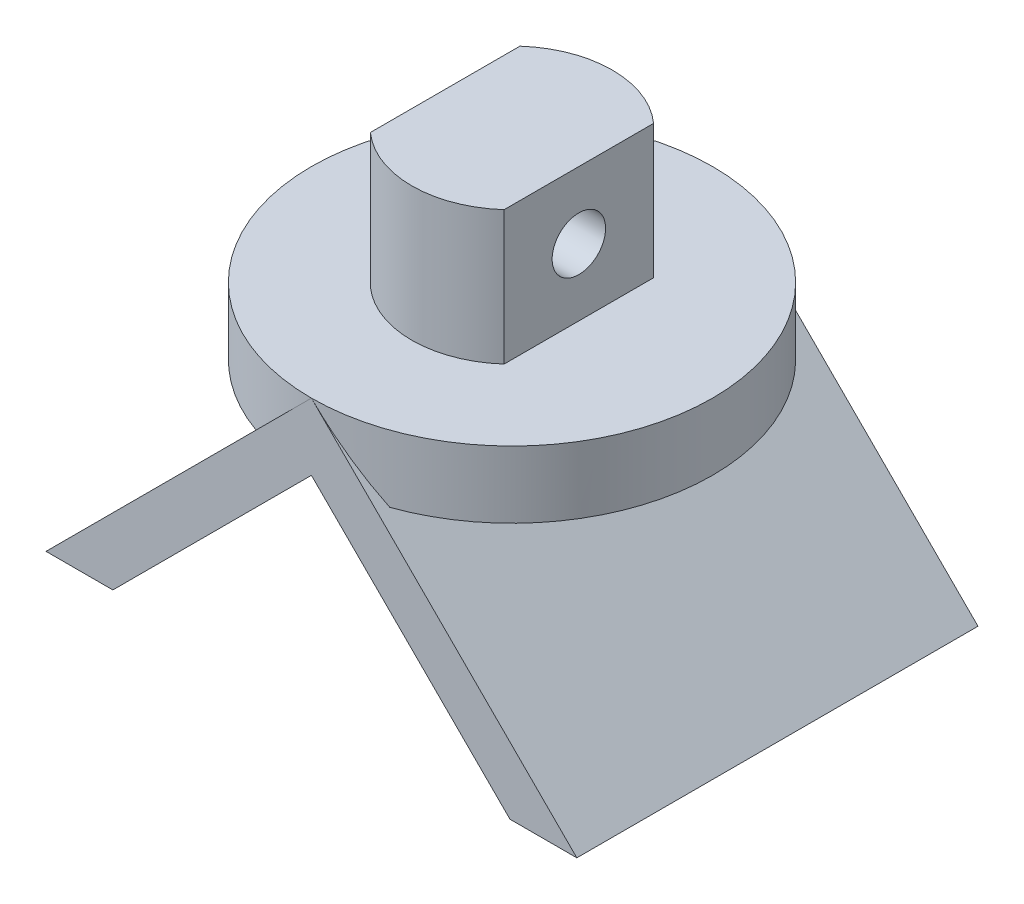
ISO-10303-21;
HEADER;
FILE_DESCRIPTION(('STEP AP214'),'2;1');
FILE_NAME('part.step','',(''),(''),'','','');
FILE_SCHEMA(('AUTOMOTIVE_DESIGN { 1 0 10303 214 1 1 1 1 }'));
ENDSEC;
DATA;
#1=APPLICATION_CONTEXT('core data for automotive mechanical design processes');
#2=APPLICATION_PROTOCOL_DEFINITION('international standard','automotive_design',2000,#1);
#3=PRODUCT_CONTEXT('',#1,'mechanical');
#4=PRODUCT('Part','Part','',(#3));
#5=PRODUCT_RELATED_PRODUCT_CATEGORY('part','',(#4));
#6=PRODUCT_DEFINITION_FORMATION('','',#4);
#7=PRODUCT_DEFINITION_CONTEXT('part definition',#1,'design');
#8=PRODUCT_DEFINITION('design','',#6,#7);
#9=PRODUCT_DEFINITION_SHAPE('','',#8);
#10=(LENGTH_UNIT() NAMED_UNIT(*) SI_UNIT(.MILLI.,.METRE.));
#11=(NAMED_UNIT(*) PLANE_ANGLE_UNIT() SI_UNIT($,.RADIAN.));
#12=(NAMED_UNIT(*) SI_UNIT($,.STERADIAN.) SOLID_ANGLE_UNIT());
#13=UNCERTAINTY_MEASURE_WITH_UNIT(LENGTH_MEASURE(1.E-05),#10,'distance_accuracy_value','');
#14=(GEOMETRIC_REPRESENTATION_CONTEXT(3) GLOBAL_UNCERTAINTY_ASSIGNED_CONTEXT((#13)) GLOBAL_UNIT_ASSIGNED_CONTEXT((#10,
#11,#12)) REPRESENTATION_CONTEXT('',''));
#15=CARTESIAN_POINT('',(0.,0.,0.));
#16=DIRECTION('',(0.,0.,1.));
#17=DIRECTION('',(1.,0.,0.));
#18=AXIS2_PLACEMENT_3D('',#15,#16,#17);
#19=CARTESIAN_POINT('',(19.8492424049175,0.,30.));
#20=DIRECTION('',(-0.707106781186547,-0.707106781186548,0.));
#21=DIRECTION('',(0.707106781186548,-0.707106781186547,0.));
#22=AXIS2_PLACEMENT_3D('',#19,#20,#21);
#23=PLANE('',#22);
#24=CARTESIAN_POINT('',(0.,19.8492424049175,15.));
#25=DIRECTION('',(-0.707106781186547,-0.707106781186548,0.));
#26=DIRECTION('',(0.707106781186548,-0.707106781186547,0.));
#27=AXIS2_PLACEMENT_3D('',#24,#25,#26);
#28=ELLIPSE('',#27,21.2132034355964,15.);
#29=CARTESIAN_POINT('',(4.99999999999998,14.8492424049175,0.857864376269049));
#30=VERTEX_POINT('',#29);
#31=CARTESIAN_POINT('',(0.,19.8492424049175,0.));
#32=VERTEX_POINT('',#31);
#33=EDGE_CURVE('E59',#30,#32,#28,.F.);
#34=ORIENTED_EDGE('',*,*,#33,.F.);
#35=DIRECTION('',(0.,0.,-1.));
#36=VECTOR('',#35,1.);
#37=CARTESIAN_POINT('',(4.99999999999998,14.8492424049175,30.));
#38=LINE('',#37,#36);
#39=CARTESIAN_POINT('',(4.99999999999998,14.8492424049175,29.1421356237309));
#40=VERTEX_POINT('',#39);
#41=EDGE_CURVE('E168',#40,#30,#38,.T.);
#42=ORIENTED_EDGE('',*,*,#41,.F.);
#43=CARTESIAN_POINT('',(0.,19.8492424049175,30.));
#44=VERTEX_POINT('',#43);
#45=EDGE_CURVE('E174',#44,#40,#28,.F.);
#46=ORIENTED_EDGE('',*,*,#45,.F.);
#47=DIRECTION('',(-0.707106781186548,0.707106781186547,0.));
#48=VECTOR('',#47,1.);
#49=CARTESIAN_POINT('',(19.8492424049175,0.,30.));
#50=LINE('',#49,#48);
#51=CARTESIAN_POINT('',(19.8492424049175,0.,30.));
#52=VERTEX_POINT('',#51);
#53=EDGE_CURVE('E187',#52,#44,#50,.T.);
#54=ORIENTED_EDGE('',*,*,#53,.F.);
#55=DIRECTION('',(0.,0.,-1.));
#56=VECTOR('',#55,1.);
#57=CARTESIAN_POINT('',(19.8492424049175,0.,30.));
#58=LINE('',#57,#56);
#59=CARTESIAN_POINT('',(19.8492424049175,0.,0.));
#60=VERTEX_POINT('',#59);
#61=EDGE_CURVE('E207',#52,#60,#58,.T.);
#62=ORIENTED_EDGE('',*,*,#61,.T.);
#63=DIRECTION('',(-0.707106781186548,0.707106781186547,0.));
#64=VECTOR('',#63,1.);
#65=CARTESIAN_POINT('',(19.8492424049175,0.,0.));
#66=LINE('',#65,#64);
#67=EDGE_CURVE('E202',#60,#32,#66,.T.);
#68=ORIENTED_EDGE('',*,*,#67,.T.);
#69=EDGE_LOOP('',(#34,#42,#46,#54,#62,#68));
#70=FACE_BOUND('',#69,.T.);
#71=ADVANCED_FACE('F36',(#70),#23,.F.);
#72=CARTESIAN_POINT('',(0.,19.8492424049175,30.));
#73=DIRECTION('',(0.707106781186548,-0.707106781186547,0.));
#74=DIRECTION('',(0.707106781186547,0.707106781186548,0.));
#75=AXIS2_PLACEMENT_3D('',#72,#73,#74);
#76=PLANE('',#75);
#77=CARTESIAN_POINT('',(0.,19.8492424049175,15.));
#78=DIRECTION('',(0.707106781186548,-0.707106781186547,0.));
#79=DIRECTION('',(-0.707106781186547,-0.707106781186548,0.));
#80=AXIS2_PLACEMENT_3D('',#77,#78,#79);
#81=ELLIPSE('',#80,21.2132034355964,15.);
#82=CARTESIAN_POINT('',(-5.00000000000001,14.8492424049175,29.142135623731));
#83=VERTEX_POINT('',#82);
#84=EDGE_CURVE('E173',#83,#44,#81,.F.);
#85=ORIENTED_EDGE('',*,*,#84,.F.);
#86=DIRECTION('',(0.,0.,1.));
#87=VECTOR('',#86,1.);
#88=CARTESIAN_POINT('',(-5.00000000000001,14.8492424049175,30.));
#89=LINE('',#88,#87);
#90=CARTESIAN_POINT('',(-5.00000000000001,14.8492424049175,0.857864376269047));
#91=VERTEX_POINT('',#90);
#92=EDGE_CURVE('E163',#91,#83,#89,.T.);
#93=ORIENTED_EDGE('',*,*,#92,.F.);
#94=EDGE_CURVE('E170',#32,#91,#81,.F.);
#95=ORIENTED_EDGE('',*,*,#94,.F.);
#96=DIRECTION('',(-0.707106781186547,-0.707106781186548,0.));
#97=VECTOR('',#96,1.);
#98=CARTESIAN_POINT('',(0.,19.8492424049175,0.));
#99=LINE('',#98,#97);
#100=CARTESIAN_POINT('',(-19.8492424049175,0.,0.));
#101=VERTEX_POINT('',#100);
#102=EDGE_CURVE('E181',#32,#101,#99,.T.);
#103=ORIENTED_EDGE('',*,*,#102,.T.);
#104=DIRECTION('',(0.,0.,-1.));
#105=VECTOR('',#104,1.);
#106=CARTESIAN_POINT('',(-19.8492424049175,0.,30.));
#107=LINE('',#106,#105);
#108=CARTESIAN_POINT('',(-19.8492424049175,0.,30.));
#109=VERTEX_POINT('',#108);
#110=EDGE_CURVE('E192',#109,#101,#107,.T.);
#111=ORIENTED_EDGE('',*,*,#110,.F.);
#112=DIRECTION('',(-0.707106781186547,-0.707106781186548,0.));
#113=VECTOR('',#112,1.);
#114=CARTESIAN_POINT('',(0.,19.8492424049175,30.));
#115=LINE('',#114,#113);
#116=EDGE_CURVE('E190',#44,#109,#115,.T.);
#117=ORIENTED_EDGE('',*,*,#116,.F.);
#118=EDGE_LOOP('',(#85,#93,#95,#103,#111,#117));
#119=FACE_BOUND('',#118,.T.);
#120=ADVANCED_FACE('F237',(#119),#76,.F.);
#121=CARTESIAN_POINT('',(-19.8492424049175,0.,30.));
#122=DIRECTION('',(0.,1.,0.));
#123=DIRECTION('',(-1.,0.,0.));
#124=AXIS2_PLACEMENT_3D('',#121,#122,#123);
#125=PLANE('',#124);
#126=DIRECTION('',(1.,0.,0.));
#127=VECTOR('',#126,1.);
#128=CARTESIAN_POINT('',(-19.8492424049175,0.,0.));
#129=LINE('',#128,#127);
#130=CARTESIAN_POINT('',(-14.8492424049175,0.,0.));
#131=VERTEX_POINT('',#130);
#132=EDGE_CURVE('E193',#101,#131,#129,.T.);
#133=ORIENTED_EDGE('',*,*,#132,.T.);
#134=DIRECTION('',(0.,0.,-1.));
#135=VECTOR('',#134,1.);
#136=CARTESIAN_POINT('',(-14.8492424049175,0.,30.));
#137=LINE('',#136,#135);
#138=CARTESIAN_POINT('',(-14.8492424049175,0.,30.));
#139=VERTEX_POINT('',#138);
#140=EDGE_CURVE('E11',#139,#131,#137,.T.);
#141=ORIENTED_EDGE('',*,*,#140,.F.);
#142=DIRECTION('',(1.,0.,0.));
#143=VECTOR('',#142,1.);
#144=CARTESIAN_POINT('',(-19.8492424049175,0.,30.));
#145=LINE('',#144,#143);
#146=EDGE_CURVE('E177',#109,#139,#145,.T.);
#147=ORIENTED_EDGE('',*,*,#146,.F.);
#148=ORIENTED_EDGE('',*,*,#110,.T.);
#149=EDGE_LOOP('',(#133,#141,#147,#148));
#150=FACE_BOUND('',#149,.T.);
#151=ADVANCED_FACE('F38',(#150),#125,.F.);
#152=CARTESIAN_POINT('',(-14.8492424049175,0.,30.));
#153=DIRECTION('',(-0.707106781186548,0.707106781186547,0.));
#154=DIRECTION('',(-0.707106781186547,-0.707106781186548,0.));
#155=AXIS2_PLACEMENT_3D('',#152,#153,#154);
#156=PLANE('',#155);
#157=DIRECTION('',(0.707106781186547,0.707106781186548,0.));
#158=VECTOR('',#157,1.);
#159=CARTESIAN_POINT('',(-14.8492424049175,0.,0.));
#160=LINE('',#159,#158);
#161=CARTESIAN_POINT('',(0.,14.8492424049175,0.));
#162=VERTEX_POINT('',#161);
#163=EDGE_CURVE('E196',#131,#162,#160,.T.);
#164=ORIENTED_EDGE('',*,*,#163,.T.);
#165=DIRECTION('',(0.,0.,-1.));
#166=VECTOR('',#165,1.);
#167=CARTESIAN_POINT('',(0.,14.8492424049175,30.));
#168=LINE('',#167,#166);
#169=CARTESIAN_POINT('',(0.,14.8492424049175,30.));
#170=VERTEX_POINT('',#169);
#171=EDGE_CURVE('E44',#170,#162,#168,.T.);
#172=ORIENTED_EDGE('',*,*,#171,.F.);
#173=DIRECTION('',(0.707106781186547,0.707106781186548,0.));
#174=VECTOR('',#173,1.);
#175=CARTESIAN_POINT('',(-14.8492424049175,0.,30.));
#176=LINE('',#175,#174);
#177=EDGE_CURVE('E180',#139,#170,#176,.T.);
#178=ORIENTED_EDGE('',*,*,#177,.F.);
#179=ORIENTED_EDGE('',*,*,#140,.T.);
#180=EDGE_LOOP('',(#164,#172,#178,#179));
#181=FACE_BOUND('',#180,.T.);
#182=ADVANCED_FACE('F275',(#181),#156,.F.);
#183=CARTESIAN_POINT('',(0.,14.8492424049175,30.));
#184=DIRECTION('',(0.707106781186547,0.707106781186548,0.));
#185=DIRECTION('',(-0.707106781186548,0.707106781186547,0.));
#186=AXIS2_PLACEMENT_3D('',#183,#184,#185);
#187=PLANE('',#186);
#188=DIRECTION('',(0.707106781186548,-0.707106781186547,0.));
#189=VECTOR('',#188,1.);
#190=CARTESIAN_POINT('',(0.,14.8492424049175,0.));
#191=LINE('',#190,#189);
#192=CARTESIAN_POINT('',(14.8492424049175,0.,0.));
#193=VERTEX_POINT('',#192);
#194=EDGE_CURVE('E198',#162,#193,#191,.T.);
#195=ORIENTED_EDGE('',*,*,#194,.T.);
#196=DIRECTION('',(0.,0.,-1.));
#197=VECTOR('',#196,1.);
#198=CARTESIAN_POINT('',(14.8492424049175,0.,30.));
#199=LINE('',#198,#197);
#200=CARTESIAN_POINT('',(14.8492424049175,0.,30.));
#201=VERTEX_POINT('',#200);
#202=EDGE_CURVE('E210',#201,#193,#199,.T.);
#203=ORIENTED_EDGE('',*,*,#202,.F.);
#204=DIRECTION('',(0.707106781186548,-0.707106781186547,0.));
#205=VECTOR('',#204,1.);
#206=CARTESIAN_POINT('',(0.,14.8492424049175,30.));
#207=LINE('',#206,#205);
#208=EDGE_CURVE('E183',#170,#201,#207,.T.);
#209=ORIENTED_EDGE('',*,*,#208,.F.);
#210=ORIENTED_EDGE('',*,*,#171,.T.);
#211=EDGE_LOOP('',(#195,#203,#209,#210));
#212=FACE_BOUND('',#211,.T.);
#213=ADVANCED_FACE('F217',(#212),#187,.F.);
#214=CARTESIAN_POINT('',(14.8492424049175,0.,30.));
#215=DIRECTION('',(0.,1.,0.));
#216=DIRECTION('',(-1.,0.,0.));
#217=AXIS2_PLACEMENT_3D('',#214,#215,#216);
#218=PLANE('',#217);
#219=DIRECTION('',(1.,0.,0.));
#220=VECTOR('',#219,1.);
#221=CARTESIAN_POINT('',(14.8492424049175,0.,0.));
#222=LINE('',#221,#220);
#223=EDGE_CURVE('E200',#193,#60,#222,.T.);
#224=ORIENTED_EDGE('',*,*,#223,.T.);
#225=ORIENTED_EDGE('',*,*,#61,.F.);
#226=DIRECTION('',(1.,0.,0.));
#227=VECTOR('',#226,1.);
#228=CARTESIAN_POINT('',(14.8492424049175,0.,30.));
#229=LINE('',#228,#227);
#230=EDGE_CURVE('E185',#201,#52,#229,.T.);
#231=ORIENTED_EDGE('',*,*,#230,.F.);
#232=ORIENTED_EDGE('',*,*,#202,.T.);
#233=EDGE_LOOP('',(#224,#225,#231,#232));
#234=FACE_BOUND('',#233,.T.);
#235=ADVANCED_FACE('F228',(#234),#218,.F.);
#236=CARTESIAN_POINT('',(0.,0.,30.));
#237=DIRECTION('',(0.,0.,1.));
#238=DIRECTION('',(1.,0.,0.));
#239=AXIS2_PLACEMENT_3D('',#236,#237,#238);
#240=PLANE('',#239);
#241=ORIENTED_EDGE('',*,*,#53,.T.);
#242=ORIENTED_EDGE('',*,*,#116,.T.);
#243=ORIENTED_EDGE('',*,*,#146,.T.);
#244=ORIENTED_EDGE('',*,*,#177,.T.);
#245=ORIENTED_EDGE('',*,*,#208,.T.);
#246=ORIENTED_EDGE('',*,*,#230,.T.);
#247=EDGE_LOOP('',(#241,#242,#243,#244,#245,#246));
#248=FACE_BOUND('',#247,.T.);
#249=ADVANCED_FACE('F233',(#248),#240,.T.);
#250=CARTESIAN_POINT('',(0.,0.,0.));
#251=DIRECTION('',(0.,0.,1.));
#252=DIRECTION('',(1.,0.,0.));
#253=AXIS2_PLACEMENT_3D('',#250,#251,#252);
#254=PLANE('',#253);
#255=ORIENTED_EDGE('',*,*,#194,.F.);
#256=ORIENTED_EDGE('',*,*,#163,.F.);
#257=ORIENTED_EDGE('',*,*,#132,.F.);
#258=ORIENTED_EDGE('',*,*,#102,.F.);
#259=ORIENTED_EDGE('',*,*,#67,.F.);
#260=ORIENTED_EDGE('',*,*,#223,.F.);
#261=EDGE_LOOP('',(#255,#256,#257,#258,#259,#260));
#262=FACE_BOUND('',#261,.T.);
#263=ADVANCED_FACE('F222',(#262),#254,.F.);
#264=CARTESIAN_POINT('',(0.,19.8492424049175,15.));
#265=DIRECTION('',(0.,-1.,0.));
#266=DIRECTION('',(0.,0.,-1.));
#267=AXIS2_PLACEMENT_3D('',#264,#265,#266);
#268=CYLINDRICAL_SURFACE('',#267,15.);
#269=CARTESIAN_POINT('',(0.,14.8492424049175,15.));
#270=DIRECTION('',(0.,1.,0.));
#271=DIRECTION('',(0.,0.,1.));
#272=AXIS2_PLACEMENT_3D('',#269,#270,#271);
#273=CIRCLE('',#272,15.);
#274=EDGE_CURVE('E155',#40,#30,#273,.T.);
#275=ORIENTED_EDGE('',*,*,#274,.T.);
#276=ORIENTED_EDGE('',*,*,#33,.T.);
#277=CARTESIAN_POINT('',(0.,19.8492424049175,15.));
#278=DIRECTION('',(0.,1.,0.));
#279=DIRECTION('',(0.,0.,1.));
#280=AXIS2_PLACEMENT_3D('',#277,#278,#279);
#281=CIRCLE('',#280,15.);
#282=EDGE_CURVE('E161',#44,#32,#281,.T.);
#283=ORIENTED_EDGE('',*,*,#282,.F.);
#284=ORIENTED_EDGE('',*,*,#45,.T.);
#285=EDGE_LOOP('',(#275,#276,#283,#284));
#286=FACE_BOUND('',#285,.T.);
#287=ADVANCED_FACE('F249',(#286),#268,.T.);
#288=EDGE_CURVE('E152',#91,#83,#273,.T.);
#289=ORIENTED_EDGE('',*,*,#288,.T.);
#290=ORIENTED_EDGE('',*,*,#84,.T.);
#291=EDGE_CURVE('E164',#32,#44,#281,.T.);
#292=ORIENTED_EDGE('',*,*,#291,.F.);
#293=ORIENTED_EDGE('',*,*,#94,.T.);
#294=EDGE_LOOP('',(#289,#290,#292,#293));
#295=FACE_BOUND('',#294,.T.);
#296=ADVANCED_FACE('F242',(#295),#268,.T.);
#297=CARTESIAN_POINT('',(0.,19.8492424049175,15.));
#298=DIRECTION('',(0.,1.,0.));
#299=DIRECTION('',(0.,0.,1.));
#300=AXIS2_PLACEMENT_3D('',#297,#298,#299);
#301=PLANE('',#300);
#302=CARTESIAN_POINT('',(0.,19.8492424049175,15.));
#303=DIRECTION('',(0.,1.,0.));
#304=DIRECTION('',(0.,0.,1.));
#305=AXIS2_PLACEMENT_3D('',#302,#303,#304);
#306=CIRCLE('',#305,7.5);
#307=CARTESIAN_POINT('',(-5.,19.8492424049175,20.5901699437495));
#308=VERTEX_POINT('',#307);
#309=CARTESIAN_POINT('',(5.,19.8492424049175,20.5901699437495));
#310=VERTEX_POINT('',#309);
#311=EDGE_CURVE('E411',#308,#310,#306,.T.);
#312=ORIENTED_EDGE('',*,*,#311,.F.);
#313=DIRECTION('',(0.,0.,1.));
#314=VECTOR('',#313,1.);
#315=CARTESIAN_POINT('',(-5.00000000000001,19.8492424049175,0.));
#316=LINE('',#315,#314);
#317=CARTESIAN_POINT('',(-5.,19.8492424049175,9.40983005625051));
#318=VERTEX_POINT('',#317);
#319=EDGE_CURVE('E150',#318,#308,#316,.T.);
#320=ORIENTED_EDGE('',*,*,#319,.F.);
#321=CARTESIAN_POINT('',(0.,19.8492424049175,15.));
#322=DIRECTION('',(0.,1.,0.));
#323=DIRECTION('',(0.,0.,1.));
#324=AXIS2_PLACEMENT_3D('',#321,#322,#323);
#325=CIRCLE('',#324,7.5);
#326=CARTESIAN_POINT('',(4.99999999999999,19.8492424049175,9.40983005625053));
#327=VERTEX_POINT('',#326);
#328=EDGE_CURVE('E146',#327,#318,#325,.T.);
#329=ORIENTED_EDGE('',*,*,#328,.F.);
#330=DIRECTION('',(0.,0.,1.));
#331=VECTOR('',#330,1.);
#332=CARTESIAN_POINT('',(5.,19.8492424049175,0.));
#333=LINE('',#332,#331);
#334=EDGE_CURVE('E51',#327,#310,#333,.T.);
#335=ORIENTED_EDGE('',*,*,#334,.T.);
#336=EDGE_LOOP('',(#312,#320,#329,#335));
#337=FACE_BOUND('',#336,.T.);
#338=ORIENTED_EDGE('',*,*,#291,.T.);
#339=ORIENTED_EDGE('',*,*,#282,.T.);
#340=EDGE_LOOP('',(#338,#339));
#341=FACE_BOUND('',#340,.T.);
#342=ADVANCED_FACE('F246',(#337,#341),#301,.T.);
#343=CARTESIAN_POINT('',(0.,14.8492424049175,15.));
#344=DIRECTION('',(0.,1.,0.));
#345=DIRECTION('',(0.,0.,1.));
#346=AXIS2_PLACEMENT_3D('',#343,#344,#345);
#347=PLANE('',#346);
#348=ORIENTED_EDGE('',*,*,#274,.F.);
#349=ORIENTED_EDGE('',*,*,#41,.T.);
#350=EDGE_LOOP('',(#348,#349));
#351=FACE_BOUND('',#350,.T.);
#352=ADVANCED_FACE('F252',(#351),#347,.F.);
#353=ORIENTED_EDGE('',*,*,#288,.F.);
#354=ORIENTED_EDGE('',*,*,#92,.T.);
#355=EDGE_LOOP('',(#353,#354));
#356=FACE_BOUND('',#355,.T.);
#357=ADVANCED_FACE('F254',(#356),#347,.F.);
#358=CARTESIAN_POINT('',(-5.00000000000001,29.8492424049175,0.));
#359=DIRECTION('',(1.,0.,0.));
#360=DIRECTION('',(0.,0.,-1.));
#361=AXIS2_PLACEMENT_3D('',#358,#359,#360);
#362=PLANE('',#361);
#363=CARTESIAN_POINT('',(-5.,24.8492424049175,15.));
#364=DIRECTION('',(-1.,0.,0.));
#365=DIRECTION('',(0.,0.,1.));
#366=AXIS2_PLACEMENT_3D('',#363,#364,#365);
#367=CIRCLE('',#366,2.);
#368=CARTESIAN_POINT('',(-5.,24.8492424049175,17.));
#369=VERTEX_POINT('',#368);
#370=EDGE_CURVE('E403',#369,#369,#367,.T.);
#371=ORIENTED_EDGE('',*,*,#370,.F.);
#372=EDGE_LOOP('',(#371));
#373=FACE_BOUND('',#372,.T.);
#374=ORIENTED_EDGE('',*,*,#319,.T.);
#375=DIRECTION('',(0.,-1.,0.));
#376=VECTOR('',#375,1.);
#377=CARTESIAN_POINT('',(-5.,29.8492424049175,20.5901699437495));
#378=LINE('',#377,#376);
#379=CARTESIAN_POINT('',(-5.,29.8492424049175,20.5901699437495));
#380=VERTEX_POINT('',#379);
#381=EDGE_CURVE('E130',#380,#308,#378,.T.);
#382=ORIENTED_EDGE('',*,*,#381,.F.);
#383=DIRECTION('',(0.,0.,1.));
#384=VECTOR('',#383,1.);
#385=CARTESIAN_POINT('',(-5.00000000000001,29.8492424049175,0.));
#386=LINE('',#385,#384);
#387=CARTESIAN_POINT('',(-5.,29.8492424049175,9.40983005625051));
#388=VERTEX_POINT('',#387);
#389=EDGE_CURVE('E137',#388,#380,#386,.T.);
#390=ORIENTED_EDGE('',*,*,#389,.F.);
#391=DIRECTION('',(0.,-1.,0.));
#392=VECTOR('',#391,1.);
#393=CARTESIAN_POINT('',(-5.,29.8492424049175,9.40983005625051));
#394=LINE('',#393,#392);
#395=EDGE_CURVE('E409',#388,#318,#394,.T.);
#396=ORIENTED_EDGE('',*,*,#395,.T.);
#397=EDGE_LOOP('',(#374,#382,#390,#396));
#398=FACE_BOUND('',#397,.T.);
#399=ADVANCED_FACE('F148',(#373,#398),#362,.F.);
#400=CARTESIAN_POINT('',(0.,29.8492424049175,15.));
#401=DIRECTION('',(0.,-1.,0.));
#402=DIRECTION('',(0.,0.,-1.));
#403=AXIS2_PLACEMENT_3D('',#400,#401,#402);
#404=CYLINDRICAL_SURFACE('',#403,7.5);
#405=ORIENTED_EDGE('',*,*,#311,.T.);
#406=DIRECTION('',(0.,-1.,0.));
#407=VECTOR('',#406,1.);
#408=CARTESIAN_POINT('',(5.,29.8492424049175,20.5901699437495));
#409=LINE('',#408,#407);
#410=CARTESIAN_POINT('',(5.,29.8492424049175,20.5901699437495));
#411=VERTEX_POINT('',#410);
#412=EDGE_CURVE('E132',#411,#310,#409,.T.);
#413=ORIENTED_EDGE('',*,*,#412,.F.);
#414=CARTESIAN_POINT('',(0.,29.8492424049175,15.));
#415=DIRECTION('',(0.,1.,0.));
#416=DIRECTION('',(0.,0.,1.));
#417=AXIS2_PLACEMENT_3D('',#414,#415,#416);
#418=CIRCLE('',#417,7.5);
#419=EDGE_CURVE('E125',#380,#411,#418,.T.);
#420=ORIENTED_EDGE('',*,*,#419,.F.);
#421=ORIENTED_EDGE('',*,*,#381,.T.);
#422=EDGE_LOOP('',(#405,#413,#420,#421));
#423=FACE_BOUND('',#422,.T.);
#424=ADVANCED_FACE('F128',(#423),#404,.T.);
#425=CARTESIAN_POINT('',(5.,29.8492424049175,0.));
#426=DIRECTION('',(1.,0.,0.));
#427=DIRECTION('',(0.,0.,-1.));
#428=AXIS2_PLACEMENT_3D('',#425,#426,#427);
#429=PLANE('',#428);
#430=CARTESIAN_POINT('',(5.,24.8492424049175,15.));
#431=DIRECTION('',(-1.,0.,0.));
#432=DIRECTION('',(0.,0.,1.));
#433=AXIS2_PLACEMENT_3D('',#430,#431,#432);
#434=CIRCLE('',#433,2.);
#435=CARTESIAN_POINT('',(5.,24.8492424049175,17.));
#436=VERTEX_POINT('',#435);
#437=EDGE_CURVE('E400',#436,#436,#434,.T.);
#438=ORIENTED_EDGE('',*,*,#437,.T.);
#439=EDGE_LOOP('',(#438));
#440=FACE_BOUND('',#439,.T.);
#441=ORIENTED_EDGE('',*,*,#334,.F.);
#442=DIRECTION('',(0.,-1.,0.));
#443=VECTOR('',#442,1.);
#444=CARTESIAN_POINT('',(5.,29.8492424049175,9.40983005625051));
#445=LINE('',#444,#443);
#446=CARTESIAN_POINT('',(5.,29.8492424049175,9.40983005625051));
#447=VERTEX_POINT('',#446);
#448=EDGE_CURVE('E157',#447,#327,#445,.T.);
#449=ORIENTED_EDGE('',*,*,#448,.F.);
#450=DIRECTION('',(0.,0.,1.));
#451=VECTOR('',#450,1.);
#452=CARTESIAN_POINT('',(5.,29.8492424049175,0.));
#453=LINE('',#452,#451);
#454=EDGE_CURVE('E136',#447,#411,#453,.T.);
#455=ORIENTED_EDGE('',*,*,#454,.T.);
#456=ORIENTED_EDGE('',*,*,#412,.T.);
#457=EDGE_LOOP('',(#441,#449,#455,#456));
#458=FACE_BOUND('',#457,.T.);
#459=ADVANCED_FACE('F348',(#440,#458),#429,.T.);
#460=CARTESIAN_POINT('',(0.,29.8492424049175,15.));
#461=DIRECTION('',(0.,-1.,0.));
#462=DIRECTION('',(0.,0.,-1.));
#463=AXIS2_PLACEMENT_3D('',#460,#461,#462);
#464=CYLINDRICAL_SURFACE('',#463,7.5);
#465=ORIENTED_EDGE('',*,*,#328,.T.);
#466=ORIENTED_EDGE('',*,*,#395,.F.);
#467=CARTESIAN_POINT('',(0.,29.8492424049175,15.));
#468=DIRECTION('',(0.,1.,0.));
#469=DIRECTION('',(0.,0.,1.));
#470=AXIS2_PLACEMENT_3D('',#467,#468,#469);
#471=CIRCLE('',#470,7.5);
#472=EDGE_CURVE('E142',#447,#388,#471,.T.);
#473=ORIENTED_EDGE('',*,*,#472,.F.);
#474=ORIENTED_EDGE('',*,*,#448,.T.);
#475=EDGE_LOOP('',(#465,#466,#473,#474));
#476=FACE_BOUND('',#475,.T.);
#477=ADVANCED_FACE('F355',(#476),#464,.T.);
#478=CARTESIAN_POINT('',(0.,29.8492424049175,0.));
#479=DIRECTION('',(0.,1.,0.));
#480=DIRECTION('',(0.,0.,1.));
#481=AXIS2_PLACEMENT_3D('',#478,#479,#480);
#482=PLANE('',#481);
#483=ORIENTED_EDGE('',*,*,#389,.T.);
#484=ORIENTED_EDGE('',*,*,#419,.T.);
#485=ORIENTED_EDGE('',*,*,#454,.F.);
#486=ORIENTED_EDGE('',*,*,#472,.T.);
#487=EDGE_LOOP('',(#483,#484,#485,#486));
#488=FACE_BOUND('',#487,.T.);
#489=ADVANCED_FACE('F140',(#488),#482,.T.);
#490=CARTESIAN_POINT('',(5.,24.8492424049175,15.));
#491=DIRECTION('',(-1.,0.,0.));
#492=DIRECTION('',(0.,0.,1.));
#493=AXIS2_PLACEMENT_3D('',#490,#491,#492);
#494=CYLINDRICAL_SURFACE('',#493,2.);
#495=ORIENTED_EDGE('',*,*,#437,.F.);
#496=EDGE_LOOP('',(#495));
#497=FACE_BOUND('',#496,.T.);
#498=ORIENTED_EDGE('',*,*,#370,.T.);
#499=EDGE_LOOP('',(#498));
#500=FACE_BOUND('',#499,.T.);
#501=ADVANCED_FACE('F370',(#497,#500),#494,.F.);
#502=CLOSED_SHELL('',(#71,#120,#151,#182,#213,#235,#249,#263,#287,#296,#342,#352,#357,#399,#424,
#459,#477,#489,#501));
#503=MANIFOLD_SOLID_BREP('B2',#502);
#504=ADVANCED_BREP_SHAPE_REPRESENTATION('',(#18,#503),#14);
#505=SHAPE_DEFINITION_REPRESENTATION(#9,#504);
ENDSEC;
END-ISO-10303-21;
